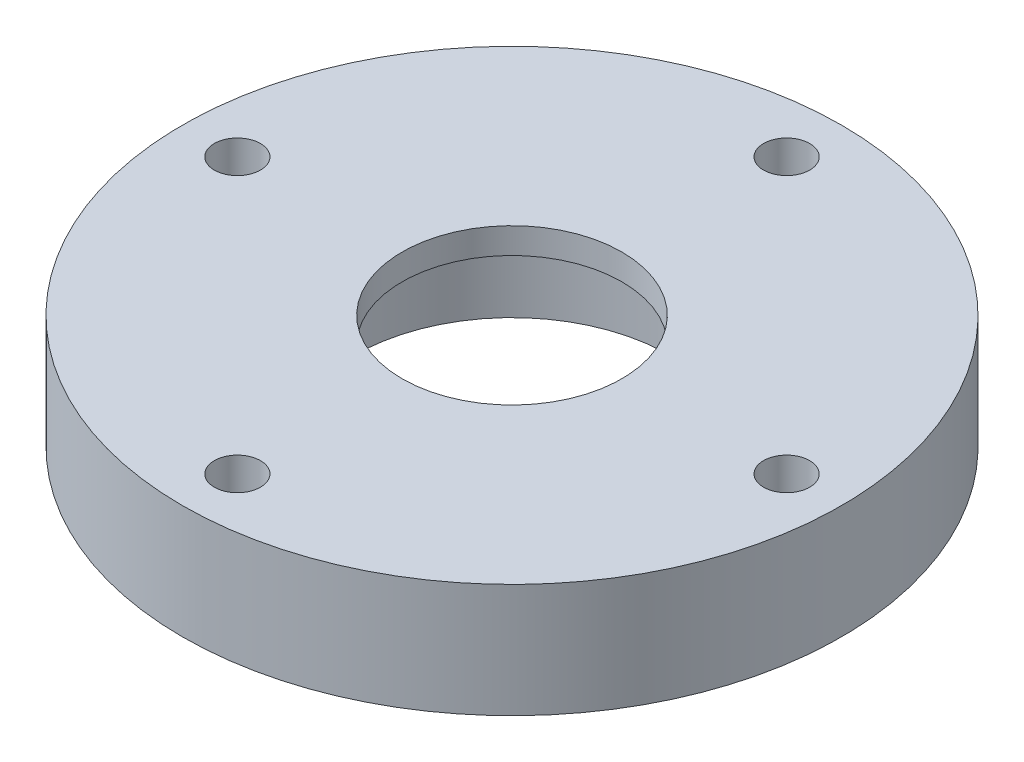
ISO-10303-21;
HEADER;
FILE_DESCRIPTION(('STEP AP214'),'2;1');
FILE_NAME('part.step','',(''),(''),'','','');
FILE_SCHEMA(('AUTOMOTIVE_DESIGN { 1 0 10303 214 1 1 1 1 }'));
ENDSEC;
DATA;
#1=APPLICATION_CONTEXT('core data for automotive mechanical design processes');
#2=APPLICATION_PROTOCOL_DEFINITION('international standard','automotive_design',2000,#1);
#3=PRODUCT_CONTEXT('',#1,'mechanical');
#4=PRODUCT('Part','Part','',(#3));
#5=PRODUCT_RELATED_PRODUCT_CATEGORY('part','',(#4));
#6=PRODUCT_DEFINITION_FORMATION('','',#4);
#7=PRODUCT_DEFINITION_CONTEXT('part definition',#1,'design');
#8=PRODUCT_DEFINITION('design','',#6,#7);
#9=PRODUCT_DEFINITION_SHAPE('','',#8);
#10=(LENGTH_UNIT() NAMED_UNIT(*) SI_UNIT(.MILLI.,.METRE.));
#11=(NAMED_UNIT(*) PLANE_ANGLE_UNIT() SI_UNIT($,.RADIAN.));
#12=(NAMED_UNIT(*) SI_UNIT($,.STERADIAN.) SOLID_ANGLE_UNIT());
#13=UNCERTAINTY_MEASURE_WITH_UNIT(LENGTH_MEASURE(1.E-05),#10,'distance_accuracy_value','');
#14=(GEOMETRIC_REPRESENTATION_CONTEXT(3) GLOBAL_UNCERTAINTY_ASSIGNED_CONTEXT((#13)) GLOBAL_UNIT_ASSIGNED_CONTEXT((#10,
#11,#12)) REPRESENTATION_CONTEXT('',''));
#15=CARTESIAN_POINT('',(0.,0.,0.));
#16=DIRECTION('',(0.,0.,1.));
#17=DIRECTION('',(1.,0.,0.));
#18=AXIS2_PLACEMENT_3D('',#15,#16,#17);
#19=CARTESIAN_POINT('',(0.,10.35,0.));
#20=DIRECTION('',(0.,1.,0.));
#21=DIRECTION('',(0.,0.,1.));
#22=AXIS2_PLACEMENT_3D('',#19,#20,#21);
#23=PLANE('',#22);
#24=CARTESIAN_POINT('',(0.,10.35,25.));
#25=DIRECTION('',(0.,1.,0.));
#26=DIRECTION('',(0.,0.,1.));
#27=AXIS2_PLACEMENT_3D('',#24,#25,#26);
#28=CIRCLE('',#27,2.1);
#29=CARTESIAN_POINT('',(0.,10.35,27.1));
#30=VERTEX_POINT('',#29);
#31=EDGE_CURVE('E58',#30,#30,#28,.T.);
#32=ORIENTED_EDGE('',*,*,#31,.F.);
#33=EDGE_LOOP('',(#32));
#34=FACE_BOUND('',#33,.T.);
#35=CARTESIAN_POINT('',(0.,10.35,-25.));
#36=DIRECTION('',(0.,1.,0.));
#37=DIRECTION('',(0.,0.,1.));
#38=AXIS2_PLACEMENT_3D('',#35,#36,#37);
#39=CIRCLE('',#38,2.1);
#40=CARTESIAN_POINT('',(0.,10.35,-22.9));
#41=VERTEX_POINT('',#40);
#42=EDGE_CURVE('E48',#41,#41,#39,.T.);
#43=ORIENTED_EDGE('',*,*,#42,.F.);
#44=EDGE_LOOP('',(#43));
#45=FACE_BOUND('',#44,.T.);
#46=CARTESIAN_POINT('',(0.,10.35,0.));
#47=DIRECTION('',(0.,1.,0.));
#48=DIRECTION('',(0.,0.,1.));
#49=AXIS2_PLACEMENT_3D('',#46,#47,#48);
#50=CIRCLE('',#49,30.);
#51=CARTESIAN_POINT('',(0.,10.35,30.));
#52=VERTEX_POINT('',#51);
#53=EDGE_CURVE('E10',#52,#52,#50,.T.);
#54=ORIENTED_EDGE('',*,*,#53,.T.);
#55=EDGE_LOOP('',(#54));
#56=FACE_BOUND('',#55,.T.);
#57=CARTESIAN_POINT('',(0.,10.35,0.));
#58=DIRECTION('',(0.,1.,0.));
#59=DIRECTION('',(0.,0.,1.));
#60=AXIS2_PLACEMENT_3D('',#57,#58,#59);
#61=CIRCLE('',#60,10.);
#62=CARTESIAN_POINT('',(0.,10.35,10.));
#63=VERTEX_POINT('',#62);
#64=EDGE_CURVE('E44',#63,#63,#61,.T.);
#65=ORIENTED_EDGE('',*,*,#64,.F.);
#66=EDGE_LOOP('',(#65));
#67=FACE_BOUND('',#66,.T.);
#68=CARTESIAN_POINT('',(25.,10.35,0.));
#69=DIRECTION('',(0.,1.,0.));
#70=DIRECTION('',(0.,0.,1.));
#71=AXIS2_PLACEMENT_3D('',#68,#69,#70);
#72=CIRCLE('',#71,2.1);
#73=CARTESIAN_POINT('',(25.,10.35,2.1));
#74=VERTEX_POINT('',#73);
#75=EDGE_CURVE('E52',#74,#74,#72,.T.);
#76=ORIENTED_EDGE('',*,*,#75,.F.);
#77=EDGE_LOOP('',(#76));
#78=FACE_BOUND('',#77,.T.);
#79=CARTESIAN_POINT('',(-25.,10.35,0.));
#80=DIRECTION('',(0.,1.,0.));
#81=DIRECTION('',(0.,0.,1.));
#82=AXIS2_PLACEMENT_3D('',#79,#80,#81);
#83=CIRCLE('',#82,2.1);
#84=CARTESIAN_POINT('',(-25.,10.35,2.1));
#85=VERTEX_POINT('',#84);
#86=EDGE_CURVE('E64',#85,#85,#83,.T.);
#87=ORIENTED_EDGE('',*,*,#86,.F.);
#88=EDGE_LOOP('',(#87));
#89=FACE_BOUND('',#88,.T.);
#90=ADVANCED_FACE('F31',(#34,#45,#56,#67,#78,#89),#23,.T.);
#91=CARTESIAN_POINT('',(0.,0.,0.));
#92=DIRECTION('',(0.,1.,0.));
#93=DIRECTION('',(0.,0.,1.));
#94=AXIS2_PLACEMENT_3D('',#91,#92,#93);
#95=PLANE('',#94);
#96=CARTESIAN_POINT('',(0.,0.,0.));
#97=DIRECTION('',(0.,1.,0.));
#98=DIRECTION('',(0.,0.,1.));
#99=AXIS2_PLACEMENT_3D('',#96,#97,#98);
#100=CIRCLE('',#99,14.3875);
#101=CARTESIAN_POINT('',(0.,0.,14.3875));
#102=VERTEX_POINT('',#101);
#103=EDGE_CURVE('E72',#102,#102,#100,.T.);
#104=ORIENTED_EDGE('',*,*,#103,.T.);
#105=EDGE_LOOP('',(#104));
#106=FACE_BOUND('',#105,.T.);
#107=CARTESIAN_POINT('',(0.,0.,0.));
#108=DIRECTION('',(0.,1.,0.));
#109=DIRECTION('',(0.,0.,1.));
#110=AXIS2_PLACEMENT_3D('',#107,#108,#109);
#111=CIRCLE('',#110,30.);
#112=CARTESIAN_POINT('',(0.,0.,30.));
#113=VERTEX_POINT('',#112);
#114=EDGE_CURVE('E39',#113,#113,#111,.T.);
#115=ORIENTED_EDGE('',*,*,#114,.F.);
#116=EDGE_LOOP('',(#115));
#117=FACE_BOUND('',#116,.T.);
#118=CARTESIAN_POINT('',(0.,0.,-25.));
#119=DIRECTION('',(0.,1.,0.));
#120=DIRECTION('',(0.,0.,1.));
#121=AXIS2_PLACEMENT_3D('',#118,#119,#120);
#122=CIRCLE('',#121,2.1);
#123=CARTESIAN_POINT('',(0.,0.,-22.9));
#124=VERTEX_POINT('',#123);
#125=EDGE_CURVE('E49',#124,#124,#122,.T.);
#126=ORIENTED_EDGE('',*,*,#125,.T.);
#127=EDGE_LOOP('',(#126));
#128=FACE_BOUND('',#127,.T.);
#129=CARTESIAN_POINT('',(25.,0.,0.));
#130=DIRECTION('',(0.,1.,0.));
#131=DIRECTION('',(0.,0.,1.));
#132=AXIS2_PLACEMENT_3D('',#129,#130,#131);
#133=CIRCLE('',#132,2.1);
#134=CARTESIAN_POINT('',(25.,0.,2.1));
#135=VERTEX_POINT('',#134);
#136=EDGE_CURVE('E55',#135,#135,#133,.T.);
#137=ORIENTED_EDGE('',*,*,#136,.T.);
#138=EDGE_LOOP('',(#137));
#139=FACE_BOUND('',#138,.T.);
#140=CARTESIAN_POINT('',(0.,0.,25.));
#141=DIRECTION('',(0.,1.,0.));
#142=DIRECTION('',(0.,0.,1.));
#143=AXIS2_PLACEMENT_3D('',#140,#141,#142);
#144=CIRCLE('',#143,2.1);
#145=CARTESIAN_POINT('',(0.,0.,27.1));
#146=VERTEX_POINT('',#145);
#147=EDGE_CURVE('E61',#146,#146,#144,.T.);
#148=ORIENTED_EDGE('',*,*,#147,.T.);
#149=EDGE_LOOP('',(#148));
#150=FACE_BOUND('',#149,.T.);
#151=CARTESIAN_POINT('',(-25.,0.,0.));
#152=DIRECTION('',(0.,1.,0.));
#153=DIRECTION('',(0.,0.,1.));
#154=AXIS2_PLACEMENT_3D('',#151,#152,#153);
#155=CIRCLE('',#154,2.1);
#156=CARTESIAN_POINT('',(-25.,0.,2.1));
#157=VERTEX_POINT('',#156);
#158=EDGE_CURVE('E67',#157,#157,#155,.T.);
#159=ORIENTED_EDGE('',*,*,#158,.T.);
#160=EDGE_LOOP('',(#159));
#161=FACE_BOUND('',#160,.T.);
#162=ADVANCED_FACE('F94',(#106,#117,#128,#139,#150,#161),#95,.F.);
#163=CARTESIAN_POINT('',(0.,10.35,0.));
#164=DIRECTION('',(0.,-1.,0.));
#165=DIRECTION('',(0.,0.,-1.));
#166=AXIS2_PLACEMENT_3D('',#163,#164,#165);
#167=CYLINDRICAL_SURFACE('',#166,30.);
#168=ORIENTED_EDGE('',*,*,#53,.F.);
#169=EDGE_LOOP('',(#168));
#170=FACE_BOUND('',#169,.T.);
#171=ORIENTED_EDGE('',*,*,#114,.T.);
#172=EDGE_LOOP('',(#171));
#173=FACE_BOUND('',#172,.T.);
#174=ADVANCED_FACE('F33',(#170,#173),#167,.T.);
#175=CARTESIAN_POINT('',(0.,10.35,0.));
#176=DIRECTION('',(0.,-1.,0.));
#177=DIRECTION('',(0.,0.,-1.));
#178=AXIS2_PLACEMENT_3D('',#175,#176,#177);
#179=CYLINDRICAL_SURFACE('',#178,10.);
#180=CARTESIAN_POINT('',(0.,8.,0.));
#181=DIRECTION('',(0.,1.,0.));
#182=DIRECTION('',(0.,0.,1.));
#183=AXIS2_PLACEMENT_3D('',#180,#181,#182);
#184=CIRCLE('',#183,10.);
#185=CARTESIAN_POINT('',(0.,8.,10.));
#186=VERTEX_POINT('',#185);
#187=EDGE_CURVE('E35',#186,#186,#184,.T.);
#188=ORIENTED_EDGE('',*,*,#187,.F.);
#189=EDGE_LOOP('',(#188));
#190=FACE_BOUND('',#189,.T.);
#191=ORIENTED_EDGE('',*,*,#64,.T.);
#192=EDGE_LOOP('',(#191));
#193=FACE_BOUND('',#192,.T.);
#194=ADVANCED_FACE('F85',(#190,#193),#179,.F.);
#195=CARTESIAN_POINT('',(0.,10.35,-25.));
#196=DIRECTION('',(0.,-1.,0.));
#197=DIRECTION('',(0.,0.,-1.));
#198=AXIS2_PLACEMENT_3D('',#195,#196,#197);
#199=CYLINDRICAL_SURFACE('',#198,2.1);
#200=ORIENTED_EDGE('',*,*,#42,.T.);
#201=EDGE_LOOP('',(#200));
#202=FACE_BOUND('',#201,.T.);
#203=ORIENTED_EDGE('',*,*,#125,.F.);
#204=EDGE_LOOP('',(#203));
#205=FACE_BOUND('',#204,.T.);
#206=ADVANCED_FACE('F88',(#202,#205),#199,.F.);
#207=CARTESIAN_POINT('',(25.,10.35,0.));
#208=DIRECTION('',(0.,-1.,0.));
#209=DIRECTION('',(0.,0.,-1.));
#210=AXIS2_PLACEMENT_3D('',#207,#208,#209);
#211=CYLINDRICAL_SURFACE('',#210,2.1);
#212=ORIENTED_EDGE('',*,*,#75,.T.);
#213=EDGE_LOOP('',(#212));
#214=FACE_BOUND('',#213,.T.);
#215=ORIENTED_EDGE('',*,*,#136,.F.);
#216=EDGE_LOOP('',(#215));
#217=FACE_BOUND('',#216,.T.);
#218=ADVANCED_FACE('F119',(#214,#217),#211,.F.);
#219=CARTESIAN_POINT('',(0.,10.35,25.));
#220=DIRECTION('',(0.,-1.,0.));
#221=DIRECTION('',(0.,0.,-1.));
#222=AXIS2_PLACEMENT_3D('',#219,#220,#221);
#223=CYLINDRICAL_SURFACE('',#222,2.1);
#224=ORIENTED_EDGE('',*,*,#31,.T.);
#225=EDGE_LOOP('',(#224));
#226=FACE_BOUND('',#225,.T.);
#227=ORIENTED_EDGE('',*,*,#147,.F.);
#228=EDGE_LOOP('',(#227));
#229=FACE_BOUND('',#228,.T.);
#230=ADVANCED_FACE('F105',(#226,#229),#223,.F.);
#231=CARTESIAN_POINT('',(-25.,10.35,0.));
#232=DIRECTION('',(0.,-1.,0.));
#233=DIRECTION('',(0.,0.,-1.));
#234=AXIS2_PLACEMENT_3D('',#231,#232,#233);
#235=CYLINDRICAL_SURFACE('',#234,2.1);
#236=ORIENTED_EDGE('',*,*,#86,.T.);
#237=EDGE_LOOP('',(#236));
#238=FACE_BOUND('',#237,.T.);
#239=ORIENTED_EDGE('',*,*,#158,.F.);
#240=EDGE_LOOP('',(#239));
#241=FACE_BOUND('',#240,.T.);
#242=ADVANCED_FACE('F101',(#238,#241),#235,.F.);
#243=CARTESIAN_POINT('',(0.,8.,0.));
#244=DIRECTION('',(0.,-1.,0.));
#245=DIRECTION('',(0.,0.,-1.));
#246=AXIS2_PLACEMENT_3D('',#243,#244,#245);
#247=CYLINDRICAL_SURFACE('',#246,14.3875);
#248=CARTESIAN_POINT('',(0.,8.,0.));
#249=DIRECTION('',(0.,1.,0.));
#250=DIRECTION('',(0.,0.,1.));
#251=AXIS2_PLACEMENT_3D('',#248,#249,#250);
#252=CIRCLE('',#251,14.3875);
#253=CARTESIAN_POINT('',(0.,8.,14.3875));
#254=VERTEX_POINT('',#253);
#255=EDGE_CURVE('E75',#254,#254,#252,.T.);
#256=ORIENTED_EDGE('',*,*,#255,.T.);
#257=EDGE_LOOP('',(#256));
#258=FACE_BOUND('',#257,.T.);
#259=ORIENTED_EDGE('',*,*,#103,.F.);
#260=EDGE_LOOP('',(#259));
#261=FACE_BOUND('',#260,.T.);
#262=ADVANCED_FACE('F104',(#258,#261),#247,.F.);
#263=CARTESIAN_POINT('',(0.,8.,0.));
#264=DIRECTION('',(0.,1.,0.));
#265=DIRECTION('',(0.,0.,1.));
#266=AXIS2_PLACEMENT_3D('',#263,#264,#265);
#267=PLANE('',#266);
#268=ORIENTED_EDGE('',*,*,#187,.T.);
#269=EDGE_LOOP('',(#268));
#270=FACE_BOUND('',#269,.T.);
#271=ORIENTED_EDGE('',*,*,#255,.F.);
#272=EDGE_LOOP('',(#271));
#273=FACE_BOUND('',#272,.T.);
#274=ADVANCED_FACE('F82',(#270,#273),#267,.F.);
#275=CLOSED_SHELL('',(#90,#162,#174,#194,#206,#218,#230,#242,#262,#274));
#276=MANIFOLD_SOLID_BREP('B2',#275);
#277=ADVANCED_BREP_SHAPE_REPRESENTATION('',(#18,#276),#14);
#278=SHAPE_DEFINITION_REPRESENTATION(#9,#277);
ENDSEC;
END-ISO-10303-21;
